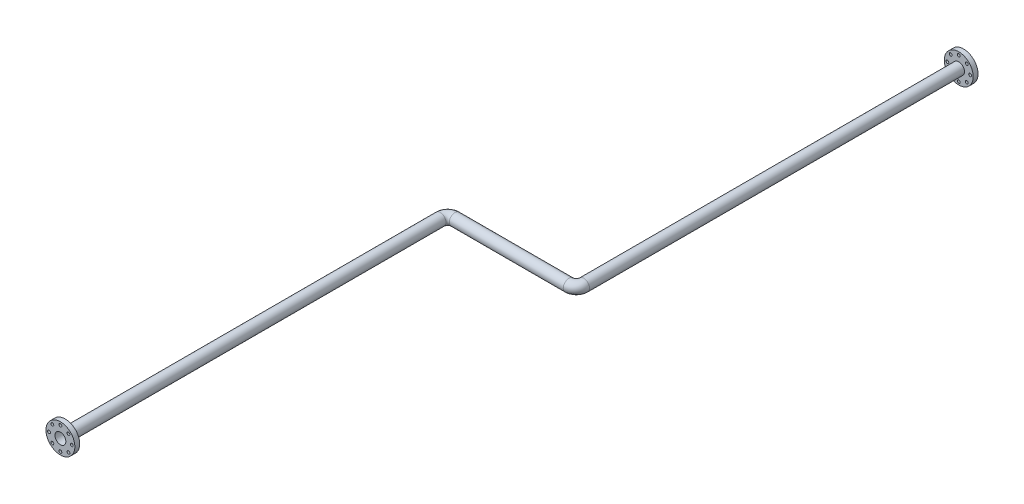
ISO-10303-21;
HEADER;
FILE_DESCRIPTION(('STEP AP214'),'2;1');
FILE_NAME('part.step','',(''),(''),'','','');
FILE_SCHEMA(('AUTOMOTIVE_DESIGN { 1 0 10303 214 1 1 1 1 }'));
ENDSEC;
DATA;
#1=APPLICATION_CONTEXT('core data for automotive mechanical design processes');
#2=APPLICATION_PROTOCOL_DEFINITION('international standard','automotive_design',2000,#1);
#3=PRODUCT_CONTEXT('',#1,'mechanical');
#4=PRODUCT('Part','Part','',(#3));
#5=PRODUCT_RELATED_PRODUCT_CATEGORY('part','',(#4));
#6=PRODUCT_DEFINITION_FORMATION('','',#4);
#7=PRODUCT_DEFINITION_CONTEXT('part definition',#1,'design');
#8=PRODUCT_DEFINITION('design','',#6,#7);
#9=PRODUCT_DEFINITION_SHAPE('','',#8);
#10=(LENGTH_UNIT() NAMED_UNIT(*) SI_UNIT(.MILLI.,.METRE.));
#11=(NAMED_UNIT(*) PLANE_ANGLE_UNIT() SI_UNIT($,.RADIAN.));
#12=(NAMED_UNIT(*) SI_UNIT($,.STERADIAN.) SOLID_ANGLE_UNIT());
#13=UNCERTAINTY_MEASURE_WITH_UNIT(LENGTH_MEASURE(1.E-05),#10,'distance_accuracy_value','');
#14=(GEOMETRIC_REPRESENTATION_CONTEXT(3) GLOBAL_UNCERTAINTY_ASSIGNED_CONTEXT((#13)) GLOBAL_UNIT_ASSIGNED_CONTEXT((#10,
#11,#12)) REPRESENTATION_CONTEXT('',''));
#15=CARTESIAN_POINT('',(0.,0.,0.));
#16=DIRECTION('',(0.,0.,1.));
#17=DIRECTION('',(1.,0.,0.));
#18=AXIS2_PLACEMENT_3D('',#15,#16,#17);
#19=CARTESIAN_POINT('',(338.999999999993,0.,-2039.));
#20=DIRECTION('',(0.,0.,1.));
#21=DIRECTION('',(1.,0.,0.));
#22=AXIS2_PLACEMENT_3D('',#19,#20,#21);
#23=CYLINDRICAL_SURFACE('',#22,30.25);
#24=CARTESIAN_POINT('',(339.,0.,-39.0000000000001));
#25=DIRECTION('',(0.,0.,-1.));
#26=DIRECTION('',(-1.,0.,0.));
#27=AXIS2_PLACEMENT_3D('',#24,#25,#26);
#28=CIRCLE('',#27,30.25);
#29=CARTESIAN_POINT('',(369.25,0.,-39.0000000000003));
#30=VERTEX_POINT('',#29);
#31=EDGE_CURVE('E125',#30,#30,#28,.T.);
#32=ORIENTED_EDGE('',*,*,#31,.T.);
#33=EDGE_LOOP('',(#32));
#34=FACE_BOUND('',#33,.T.);
#35=CARTESIAN_POINT('',(338.999999999993,0.,-2013.5));
#36=DIRECTION('',(0.,0.,-1.));
#37=DIRECTION('',(-1.,0.,0.));
#38=AXIS2_PLACEMENT_3D('',#35,#36,#37);
#39=CIRCLE('',#38,30.25);
#40=CARTESIAN_POINT('',(308.749999999993,0.,-2013.5));
#41=VERTEX_POINT('',#40);
#42=EDGE_CURVE('E10',#41,#41,#39,.T.);
#43=ORIENTED_EDGE('',*,*,#42,.F.);
#44=EDGE_LOOP('',(#43));
#45=FACE_BOUND('',#44,.T.);
#46=ADVANCED_FACE('F31',(#34,#45),#23,.T.);
#47=CARTESIAN_POINT('',(-339.,0.,2039.));
#48=DIRECTION('',(0.,0.,-1.));
#49=DIRECTION('',(-1.,0.,0.));
#50=AXIS2_PLACEMENT_3D('',#47,#48,#49);
#51=CYLINDRICAL_SURFACE('',#50,30.25);
#52=CARTESIAN_POINT('',(-339.,0.,39.0000000000001));
#53=DIRECTION('',(0.,0.,1.));
#54=DIRECTION('',(1.,0.,0.));
#55=AXIS2_PLACEMENT_3D('',#52,#53,#54);
#56=CIRCLE('',#55,30.25);
#57=CARTESIAN_POINT('',(-369.25,0.,39.0000000000003));
#58=VERTEX_POINT('',#57);
#59=EDGE_CURVE('E119',#58,#58,#56,.T.);
#60=ORIENTED_EDGE('',*,*,#59,.T.);
#61=EDGE_LOOP('',(#60));
#62=FACE_BOUND('',#61,.T.);
#63=CARTESIAN_POINT('',(-339.,0.,2013.5));
#64=DIRECTION('',(0.,0.,1.));
#65=DIRECTION('',(1.,0.,0.));
#66=AXIS2_PLACEMENT_3D('',#63,#64,#65);
#67=CIRCLE('',#66,30.25);
#68=CARTESIAN_POINT('',(-308.75,0.,2013.5));
#69=VERTEX_POINT('',#68);
#70=EDGE_CURVE('E39',#69,#69,#67,.T.);
#71=ORIENTED_EDGE('',*,*,#70,.F.);
#72=EDGE_LOOP('',(#71));
#73=FACE_BOUND('',#72,.T.);
#74=ADVANCED_FACE('F139',(#62,#73),#51,.T.);
#75=CARTESIAN_POINT('',(300.,0.,0.));
#76=DIRECTION('',(-1.,0.,0.));
#77=DIRECTION('',(0.,0.,1.));
#78=AXIS2_PLACEMENT_3D('',#75,#76,#77);
#79=CYLINDRICAL_SURFACE('',#78,30.25);
#80=CARTESIAN_POINT('',(300.,0.,0.));
#81=DIRECTION('',(1.,0.,0.));
#82=DIRECTION('',(0.,0.,-1.));
#83=AXIS2_PLACEMENT_3D('',#80,#81,#82);
#84=CIRCLE('',#83,30.25);
#85=CARTESIAN_POINT('',(300.,0.,30.25));
#86=VERTEX_POINT('',#85);
#87=EDGE_CURVE('E35',#86,#86,#84,.T.);
#88=ORIENTED_EDGE('',*,*,#87,.F.);
#89=EDGE_LOOP('',(#88));
#90=FACE_BOUND('',#89,.T.);
#91=CARTESIAN_POINT('',(-300.,0.,0.));
#92=DIRECTION('',(-1.,0.,0.));
#93=DIRECTION('',(0.,0.,1.));
#94=AXIS2_PLACEMENT_3D('',#91,#92,#93);
#95=CIRCLE('',#94,30.25);
#96=CARTESIAN_POINT('',(-300.,0.,-30.25));
#97=VERTEX_POINT('',#96);
#98=EDGE_CURVE('E114',#97,#97,#95,.T.);
#99=ORIENTED_EDGE('',*,*,#98,.F.);
#100=EDGE_LOOP('',(#99));
#101=FACE_BOUND('',#100,.T.);
#102=ADVANCED_FACE('F33',(#90,#101),#79,.T.);
#103=CARTESIAN_POINT('',(300.,0.,0.));
#104=DIRECTION('',(-1.,0.,0.));
#105=DIRECTION('',(0.,0.,1.));
#106=AXIS2_PLACEMENT_3D('',#103,#104,#105);
#107=CYLINDRICAL_SURFACE('',#106,28.65);
#108=CARTESIAN_POINT('',(300.,0.,0.));
#109=DIRECTION('',(1.,0.,0.));
#110=DIRECTION('',(0.,0.,-1.));
#111=AXIS2_PLACEMENT_3D('',#108,#109,#110);
#112=CIRCLE('',#111,28.65);
#113=CARTESIAN_POINT('',(300.,0.,28.65));
#114=VERTEX_POINT('',#113);
#115=EDGE_CURVE('E122',#114,#114,#112,.T.);
#116=ORIENTED_EDGE('',*,*,#115,.T.);
#117=EDGE_LOOP('',(#116));
#118=FACE_BOUND('',#117,.T.);
#119=CARTESIAN_POINT('',(-300.,0.,0.));
#120=DIRECTION('',(1.,0.,0.));
#121=DIRECTION('',(0.,0.,-1.));
#122=AXIS2_PLACEMENT_3D('',#119,#120,#121);
#123=CIRCLE('',#122,28.65);
#124=CARTESIAN_POINT('',(-300.,0.,-28.65));
#125=VERTEX_POINT('',#124);
#126=EDGE_CURVE('E127',#125,#125,#123,.T.);
#127=ORIENTED_EDGE('',*,*,#126,.F.);
#128=EDGE_LOOP('',(#127));
#129=FACE_BOUND('',#128,.T.);
#130=ADVANCED_FACE('F138',(#118,#129),#107,.F.);
#131=CARTESIAN_POINT('',(300.,0.,-39.));
#132=DIRECTION('',(0.,-1.,0.));
#133=DIRECTION('',(0.,0.,-1.));
#134=AXIS2_PLACEMENT_3D('',#131,#132,#133);
#135=TOROIDAL_SURFACE('',#134,39.,28.65);
#136=CARTESIAN_POINT('',(339.,0.,-39.0000000000001));
#137=DIRECTION('',(0.,0.,-1.));
#138=DIRECTION('',(-1.,0.,0.));
#139=AXIS2_PLACEMENT_3D('',#136,#137,#138);
#140=CIRCLE('',#139,28.65);
#141=CARTESIAN_POINT('',(367.65,0.,-39.0000000000002));
#142=VERTEX_POINT('',#141);
#143=EDGE_CURVE('E108',#142,#142,#140,.T.);
#144=CARTESIAN_POINT('',(300.,0.,-39.));
#145=DIRECTION('',(0.,-1.,0.));
#146=DIRECTION('',(0.,0.,-1.));
#147=AXIS2_PLACEMENT_3D('',#144,#145,#146);
#148=CIRCLE('',#147,67.65);
#149=EDGE_CURVE('',#142,#114,#148,.T.);
#150=ORIENTED_EDGE('',*,*,#143,.T.);
#151=ORIENTED_EDGE('',*,*,#115,.F.);
#152=ORIENTED_EDGE('',*,*,#149,.T.);
#153=ORIENTED_EDGE('',*,*,#149,.F.);
#154=EDGE_LOOP('',(#150,#152,#151,#153));
#155=FACE_BOUND('',#154,.T.);
#156=ADVANCED_FACE('F504',(#155),#135,.F.);
#157=CARTESIAN_POINT('',(300.,0.,-39.));
#158=DIRECTION('',(0.,-1.,0.));
#159=DIRECTION('',(0.,0.,-1.));
#160=AXIS2_PLACEMENT_3D('',#157,#158,#159);
#161=TOROIDAL_SURFACE('',#160,39.,30.25);
#162=CARTESIAN_POINT('',(300.,0.,-39.));
#163=DIRECTION('',(0.,-1.,0.));
#164=DIRECTION('',(0.,0.,-1.));
#165=AXIS2_PLACEMENT_3D('',#162,#163,#164);
#166=CIRCLE('',#165,69.25);
#167=EDGE_CURVE('',#30,#86,#166,.T.);
#168=ORIENTED_EDGE('',*,*,#31,.F.);
#169=ORIENTED_EDGE('',*,*,#87,.T.);
#170=ORIENTED_EDGE('',*,*,#167,.T.);
#171=ORIENTED_EDGE('',*,*,#167,.F.);
#172=EDGE_LOOP('',(#168,#170,#169,#171));
#173=FACE_BOUND('',#172,.T.);
#174=ADVANCED_FACE('F134',(#173),#161,.T.);
#175=CARTESIAN_POINT('',(-300.,0.,39.));
#176=DIRECTION('',(0.,-1.,0.));
#177=DIRECTION('',(0.,0.,-1.));
#178=AXIS2_PLACEMENT_3D('',#175,#176,#177);
#179=TOROIDAL_SURFACE('',#178,39.,28.65);
#180=CARTESIAN_POINT('',(-339.,0.,38.999999999999));
#181=DIRECTION('',(0.,0.,1.));
#182=DIRECTION('',(1.,0.,0.));
#183=AXIS2_PLACEMENT_3D('',#180,#181,#182);
#184=CIRCLE('',#183,28.65);
#185=CARTESIAN_POINT('',(-367.65,0.,38.9999999999982));
#186=VERTEX_POINT('',#185);
#187=EDGE_CURVE('E102',#186,#186,#184,.T.);
#188=CARTESIAN_POINT('',(-300.,0.,39.));
#189=DIRECTION('',(0.,-1.,0.));
#190=DIRECTION('',(0.,0.,-1.));
#191=AXIS2_PLACEMENT_3D('',#188,#189,#190);
#192=CIRCLE('',#191,67.65);
#193=EDGE_CURVE('',#186,#125,#192,.T.);
#194=ORIENTED_EDGE('',*,*,#187,.T.);
#195=ORIENTED_EDGE('',*,*,#126,.T.);
#196=ORIENTED_EDGE('',*,*,#193,.T.);
#197=ORIENTED_EDGE('',*,*,#193,.F.);
#198=EDGE_LOOP('',(#194,#196,#195,#197));
#199=FACE_BOUND('',#198,.T.);
#200=ADVANCED_FACE('F145',(#199),#179,.F.);
#201=CARTESIAN_POINT('',(-300.,0.,39.));
#202=DIRECTION('',(0.,-1.,0.));
#203=DIRECTION('',(0.,0.,-1.));
#204=AXIS2_PLACEMENT_3D('',#201,#202,#203);
#205=TOROIDAL_SURFACE('',#204,39.,30.25);
#206=CARTESIAN_POINT('',(-300.,0.,39.));
#207=DIRECTION('',(0.,-1.,0.));
#208=DIRECTION('',(0.,0.,-1.));
#209=AXIS2_PLACEMENT_3D('',#206,#207,#208);
#210=CIRCLE('',#209,69.25);
#211=EDGE_CURVE('',#58,#97,#210,.T.);
#212=ORIENTED_EDGE('',*,*,#59,.F.);
#213=ORIENTED_EDGE('',*,*,#98,.T.);
#214=ORIENTED_EDGE('',*,*,#211,.T.);
#215=ORIENTED_EDGE('',*,*,#211,.F.);
#216=EDGE_LOOP('',(#212,#214,#213,#215));
#217=FACE_BOUND('',#216,.T.);
#218=ADVANCED_FACE('F142',(#217),#205,.T.);
#219=CARTESIAN_POINT('',(338.999999999993,0.,-2039.));
#220=DIRECTION('',(0.,0.,-1.));
#221=DIRECTION('',(-1.,0.,0.));
#222=AXIS2_PLACEMENT_3D('',#219,#220,#221);
#223=PLANE('',#222);
#224=CARTESIAN_POINT('',(338.999999999993,0.,-2039.));
#225=DIRECTION('',(0.,0.,-1.));
#226=DIRECTION('',(-1.,0.,0.));
#227=AXIS2_PLACEMENT_3D('',#224,#225,#226);
#228=CIRCLE('',#227,28.65);
#229=CARTESIAN_POINT('',(310.349999999993,0.,-2039.));
#230=VERTEX_POINT('',#229);
#231=EDGE_CURVE('E111',#230,#230,#228,.T.);
#232=ORIENTED_EDGE('',*,*,#231,.F.);
#233=EDGE_LOOP('',(#232));
#234=FACE_BOUND('',#233,.T.);
#235=CARTESIAN_POINT('',(338.999999999993,0.,-2039.));
#236=DIRECTION('',(0.,0.,-1.));
#237=DIRECTION('',(-1.,0.,0.));
#238=AXIS2_PLACEMENT_3D('',#235,#236,#237);
#239=CIRCLE('',#238,76.);
#240=CARTESIAN_POINT('',(262.999999999993,0.,-2039.));
#241=VERTEX_POINT('',#240);
#242=EDGE_CURVE('E47',#241,#241,#239,.T.);
#243=ORIENTED_EDGE('',*,*,#242,.T.);
#244=EDGE_LOOP('',(#243));
#245=FACE_BOUND('',#244,.T.);
#246=CARTESIAN_POINT('',(338.999999999993,60.,-2039.));
#247=DIRECTION('',(0.,0.,-1.));
#248=DIRECTION('',(-1.,0.,0.));
#249=AXIS2_PLACEMENT_3D('',#246,#247,#248);
#250=CIRCLE('',#249,7.50000000000001);
#251=CARTESIAN_POINT('',(331.499999999993,60.,-2039.));
#252=VERTEX_POINT('',#251);
#253=EDGE_CURVE('E306',#252,#252,#250,.T.);
#254=ORIENTED_EDGE('',*,*,#253,.F.);
#255=EDGE_LOOP('',(#254));
#256=FACE_BOUND('',#255,.T.);
#257=CARTESIAN_POINT('',(296.5735931288,42.4264068711928,-2039.));
#258=DIRECTION('',(0.,0.,-1.));
#259=DIRECTION('',(-1.,0.,0.));
#260=AXIS2_PLACEMENT_3D('',#257,#258,#259);
#261=CIRCLE('',#260,7.50000000000377);
#262=CARTESIAN_POINT('',(289.073593128796,42.4264068711928,-2039.));
#263=VERTEX_POINT('',#262);
#264=EDGE_CURVE('E300',#263,#263,#261,.T.);
#265=ORIENTED_EDGE('',*,*,#264,.F.);
#266=EDGE_LOOP('',(#265));
#267=FACE_BOUND('',#266,.T.);
#268=CARTESIAN_POINT('',(278.999999999993,0.,-2039.));
#269=DIRECTION('',(0.,0.,-1.));
#270=DIRECTION('',(-1.,0.,0.));
#271=AXIS2_PLACEMENT_3D('',#268,#269,#270);
#272=CIRCLE('',#271,7.50000000000987);
#273=CARTESIAN_POINT('',(271.499999999983,0.,-2039.));
#274=VERTEX_POINT('',#273);
#275=EDGE_CURVE('E294',#274,#274,#272,.T.);
#276=ORIENTED_EDGE('',*,*,#275,.F.);
#277=EDGE_LOOP('',(#276));
#278=FACE_BOUND('',#277,.T.);
#279=CARTESIAN_POINT('',(296.5735931288,-42.4264068711928,-2039.));
#280=DIRECTION('',(0.,0.,-1.));
#281=DIRECTION('',(-1.,0.,0.));
#282=AXIS2_PLACEMENT_3D('',#279,#280,#281);
#283=CIRCLE('',#282,7.50000000001466);
#284=CARTESIAN_POINT('',(289.073593128785,-42.4264068711928,-2039.));
#285=VERTEX_POINT('',#284);
#286=EDGE_CURVE('E288',#285,#285,#283,.T.);
#287=ORIENTED_EDGE('',*,*,#286,.F.);
#288=EDGE_LOOP('',(#287));
#289=FACE_BOUND('',#288,.T.);
#290=CARTESIAN_POINT('',(338.999999999993,-60.,-2039.));
#291=DIRECTION('',(0.,0.,-1.));
#292=DIRECTION('',(-1.,0.,0.));
#293=AXIS2_PLACEMENT_3D('',#290,#291,#292);
#294=CIRCLE('',#293,7.50000000001519);
#295=CARTESIAN_POINT('',(331.499999999978,-60.,-2039.));
#296=VERTEX_POINT('',#295);
#297=EDGE_CURVE('E282',#296,#296,#294,.T.);
#298=ORIENTED_EDGE('',*,*,#297,.F.);
#299=EDGE_LOOP('',(#298));
#300=FACE_BOUND('',#299,.T.);
#301=CARTESIAN_POINT('',(381.426406871186,-42.4264068711928,-2039.));
#302=DIRECTION('',(0.,0.,-1.));
#303=DIRECTION('',(-1.,0.,0.));
#304=AXIS2_PLACEMENT_3D('',#301,#302,#303);
#305=CIRCLE('',#304,7.50000000001121);
#306=CARTESIAN_POINT('',(373.926406871175,-42.4264068711928,-2039.));
#307=VERTEX_POINT('',#306);
#308=EDGE_CURVE('E276',#307,#307,#305,.T.);
#309=ORIENTED_EDGE('',*,*,#308,.F.);
#310=EDGE_LOOP('',(#309));
#311=FACE_BOUND('',#310,.T.);
#312=CARTESIAN_POINT('',(398.999999999993,0.,-2039.));
#313=DIRECTION('',(0.,0.,-1.));
#314=DIRECTION('',(-1.,0.,0.));
#315=AXIS2_PLACEMENT_3D('',#312,#313,#314);
#316=CIRCLE('',#315,7.50000000000534);
#317=CARTESIAN_POINT('',(391.499999999988,0.,-2039.));
#318=VERTEX_POINT('',#317);
#319=EDGE_CURVE('E270',#318,#318,#316,.T.);
#320=ORIENTED_EDGE('',*,*,#319,.F.);
#321=EDGE_LOOP('',(#320));
#322=FACE_BOUND('',#321,.T.);
#323=CARTESIAN_POINT('',(381.426406871186,42.4264068711928,-2039.));
#324=DIRECTION('',(0.,0.,-1.));
#325=DIRECTION('',(-1.,0.,0.));
#326=AXIS2_PLACEMENT_3D('',#323,#324,#325);
#327=CIRCLE('',#326,7.5000000000006);
#328=CARTESIAN_POINT('',(373.926406871185,42.4264068711928,-2039.));
#329=VERTEX_POINT('',#328);
#330=EDGE_CURVE('E267',#329,#329,#327,.T.);
#331=ORIENTED_EDGE('',*,*,#330,.F.);
#332=EDGE_LOOP('',(#331));
#333=FACE_BOUND('',#332,.T.);
#334=ADVANCED_FACE('F144',(#234,#245,#256,#267,#278,#289,#300,#311,#322,#333),#223,.T.);
#335=CARTESIAN_POINT('',(338.999999999993,0.,-2039.));
#336=DIRECTION('',(0.,0.,1.));
#337=DIRECTION('',(1.,0.,0.));
#338=AXIS2_PLACEMENT_3D('',#335,#336,#337);
#339=CYLINDRICAL_SURFACE('',#338,28.65);
#340=ORIENTED_EDGE('',*,*,#231,.T.);
#341=EDGE_LOOP('',(#340));
#342=FACE_BOUND('',#341,.T.);
#343=ORIENTED_EDGE('',*,*,#143,.F.);
#344=EDGE_LOOP('',(#343));
#345=FACE_BOUND('',#344,.T.);
#346=ADVANCED_FACE('F152',(#342,#345),#339,.F.);
#347=CARTESIAN_POINT('',(-339.,0.,2039.));
#348=DIRECTION('',(0.,0.,1.));
#349=DIRECTION('',(1.,0.,0.));
#350=AXIS2_PLACEMENT_3D('',#347,#348,#349);
#351=PLANE('',#350);
#352=CARTESIAN_POINT('',(-339.,0.,2039.));
#353=DIRECTION('',(0.,0.,1.));
#354=DIRECTION('',(1.,0.,0.));
#355=AXIS2_PLACEMENT_3D('',#352,#353,#354);
#356=CIRCLE('',#355,28.65);
#357=CARTESIAN_POINT('',(-310.35,0.,2039.));
#358=VERTEX_POINT('',#357);
#359=EDGE_CURVE('E105',#358,#358,#356,.T.);
#360=ORIENTED_EDGE('',*,*,#359,.F.);
#361=EDGE_LOOP('',(#360));
#362=FACE_BOUND('',#361,.T.);
#363=CARTESIAN_POINT('',(-339.,0.,2039.));
#364=DIRECTION('',(0.,0.,1.));
#365=DIRECTION('',(1.,0.,0.));
#366=AXIS2_PLACEMENT_3D('',#363,#364,#365);
#367=CIRCLE('',#366,76.);
#368=CARTESIAN_POINT('',(-263.,0.,2039.));
#369=VERTEX_POINT('',#368);
#370=EDGE_CURVE('E96',#369,#369,#367,.T.);
#371=ORIENTED_EDGE('',*,*,#370,.T.);
#372=EDGE_LOOP('',(#371));
#373=FACE_BOUND('',#372,.T.);
#374=CARTESIAN_POINT('',(-296.573593128806,42.4264068711961,2039.));
#375=DIRECTION('',(0.,0.,1.));
#376=DIRECTION('',(1.,0.,0.));
#377=AXIS2_PLACEMENT_3D('',#374,#375,#376);
#378=CIRCLE('',#377,7.50000000000001);
#379=CARTESIAN_POINT('',(-289.073593128806,42.4264068711961,2039.));
#380=VERTEX_POINT('',#379);
#381=EDGE_CURVE('E90',#380,#380,#378,.T.);
#382=ORIENTED_EDGE('',*,*,#381,.F.);
#383=EDGE_LOOP('',(#382));
#384=FACE_BOUND('',#383,.T.);
#385=CARTESIAN_POINT('',(-339.,60.,2039.));
#386=DIRECTION('',(0.,0.,1.));
#387=DIRECTION('',(1.,0.,0.));
#388=AXIS2_PLACEMENT_3D('',#385,#386,#387);
#389=CIRCLE('',#388,7.50000000000001);
#390=CARTESIAN_POINT('',(-331.5,60.,2039.));
#391=VERTEX_POINT('',#390);
#392=EDGE_CURVE('E84',#391,#391,#389,.T.);
#393=ORIENTED_EDGE('',*,*,#392,.F.);
#394=EDGE_LOOP('',(#393));
#395=FACE_BOUND('',#394,.T.);
#396=CARTESIAN_POINT('',(-279.,0.,2039.));
#397=DIRECTION('',(0.,0.,1.));
#398=DIRECTION('',(1.,0.,0.));
#399=AXIS2_PLACEMENT_3D('',#396,#397,#398);
#400=CIRCLE('',#399,7.5000000000057);
#401=CARTESIAN_POINT('',(-271.499999999994,0.,2039.));
#402=VERTEX_POINT('',#401);
#403=EDGE_CURVE('E78',#402,#402,#400,.T.);
#404=ORIENTED_EDGE('',*,*,#403,.F.);
#405=EDGE_LOOP('',(#404));
#406=FACE_BOUND('',#405,.T.);
#407=CARTESIAN_POINT('',(-296.573593128807,-42.4264068711928,2039.));
#408=DIRECTION('',(0.,0.,1.));
#409=DIRECTION('',(1.,0.,0.));
#410=AXIS2_PLACEMENT_3D('',#407,#408,#409);
#411=CIRCLE('',#410,7.50000000000839);
#412=CARTESIAN_POINT('',(-289.073593128799,-42.4264068711928,2039.));
#413=VERTEX_POINT('',#412);
#414=EDGE_CURVE('E72',#413,#413,#411,.T.);
#415=ORIENTED_EDGE('',*,*,#414,.F.);
#416=EDGE_LOOP('',(#415));
#417=FACE_BOUND('',#416,.T.);
#418=CARTESIAN_POINT('',(-339.,-60.,2039.));
#419=DIRECTION('',(0.,0.,1.));
#420=DIRECTION('',(1.,0.,0.));
#421=AXIS2_PLACEMENT_3D('',#418,#419,#420);
#422=CIRCLE('',#421,7.50000000000877);
#423=CARTESIAN_POINT('',(-331.499999999991,-60.,2039.));
#424=VERTEX_POINT('',#423);
#425=EDGE_CURVE('E66',#424,#424,#422,.T.);
#426=ORIENTED_EDGE('',*,*,#425,.F.);
#427=EDGE_LOOP('',(#426));
#428=FACE_BOUND('',#427,.T.);
#429=CARTESIAN_POINT('',(-381.426406871193,-42.4264068711929,2039.));
#430=DIRECTION('',(0.,0.,1.));
#431=DIRECTION('',(1.,0.,0.));
#432=AXIS2_PLACEMENT_3D('',#429,#430,#431);
#433=CIRCLE('',#432,7.50000000000655);
#434=CARTESIAN_POINT('',(-373.926406871186,-42.4264068711929,2039.));
#435=VERTEX_POINT('',#434);
#436=EDGE_CURVE('E60',#435,#435,#433,.T.);
#437=ORIENTED_EDGE('',*,*,#436,.F.);
#438=EDGE_LOOP('',(#437));
#439=FACE_BOUND('',#438,.T.);
#440=CARTESIAN_POINT('',(-399.,0.,2039.));
#441=DIRECTION('',(0.,0.,1.));
#442=DIRECTION('',(1.,0.,0.));
#443=AXIS2_PLACEMENT_3D('',#440,#441,#442);
#444=CIRCLE('',#443,7.50000000000309);
#445=CARTESIAN_POINT('',(-391.499999999997,0.,2039.));
#446=VERTEX_POINT('',#445);
#447=EDGE_CURVE('E52',#446,#446,#444,.T.);
#448=ORIENTED_EDGE('',*,*,#447,.F.);
#449=EDGE_LOOP('',(#448));
#450=FACE_BOUND('',#449,.T.);
#451=CARTESIAN_POINT('',(-381.426406871191,42.4264068711896,2039.));
#452=DIRECTION('',(0.,0.,1.));
#453=DIRECTION('',(1.,0.,0.));
#454=AXIS2_PLACEMENT_3D('',#451,#452,#453);
#455=CIRCLE('',#454,7.50000000000007);
#456=CARTESIAN_POINT('',(-373.926406871191,42.4264068711896,2039.));
#457=VERTEX_POINT('',#456);
#458=EDGE_CURVE('E53',#457,#457,#455,.T.);
#459=ORIENTED_EDGE('',*,*,#458,.F.);
#460=EDGE_LOOP('',(#459));
#461=FACE_BOUND('',#460,.T.);
#462=ADVANCED_FACE('F170',(#362,#373,#384,#395,#406,#417,#428,#439,#450,#461),#351,.T.);
#463=CARTESIAN_POINT('',(-339.,0.,2039.));
#464=DIRECTION('',(0.,0.,-1.));
#465=DIRECTION('',(-1.,0.,0.));
#466=AXIS2_PLACEMENT_3D('',#463,#464,#465);
#467=CYLINDRICAL_SURFACE('',#466,28.65);
#468=ORIENTED_EDGE('',*,*,#359,.T.);
#469=EDGE_LOOP('',(#468));
#470=FACE_BOUND('',#469,.T.);
#471=ORIENTED_EDGE('',*,*,#187,.F.);
#472=EDGE_LOOP('',(#471));
#473=FACE_BOUND('',#472,.T.);
#474=ADVANCED_FACE('F175',(#470,#473),#467,.F.);
#475=CARTESIAN_POINT('',(-339.,0.,2013.5));
#476=DIRECTION('',(0.,0.,1.));
#477=DIRECTION('',(1.,0.,0.));
#478=AXIS2_PLACEMENT_3D('',#475,#476,#477);
#479=PLANE('',#478);
#480=CARTESIAN_POINT('',(-339.,0.,2013.5));
#481=DIRECTION('',(0.,0.,1.));
#482=DIRECTION('',(1.,0.,0.));
#483=AXIS2_PLACEMENT_3D('',#480,#481,#482);
#484=CIRCLE('',#483,76.);
#485=CARTESIAN_POINT('',(-263.,0.,2013.5));
#486=VERTEX_POINT('',#485);
#487=EDGE_CURVE('E99',#486,#486,#484,.T.);
#488=ORIENTED_EDGE('',*,*,#487,.F.);
#489=EDGE_LOOP('',(#488));
#490=FACE_BOUND('',#489,.T.);
#491=CARTESIAN_POINT('',(-296.573593128806,42.4264068711961,2013.5));
#492=DIRECTION('',(0.,0.,1.));
#493=DIRECTION('',(1.,0.,0.));
#494=AXIS2_PLACEMENT_3D('',#491,#492,#493);
#495=CIRCLE('',#494,7.50000000000001);
#496=CARTESIAN_POINT('',(-289.073593128806,42.4264068711961,2013.5));
#497=VERTEX_POINT('',#496);
#498=EDGE_CURVE('E93',#497,#497,#495,.T.);
#499=ORIENTED_EDGE('',*,*,#498,.T.);
#500=EDGE_LOOP('',(#499));
#501=FACE_BOUND('',#500,.T.);
#502=CARTESIAN_POINT('',(-339.,60.,2013.5));
#503=DIRECTION('',(0.,0.,1.));
#504=DIRECTION('',(1.,0.,0.));
#505=AXIS2_PLACEMENT_3D('',#502,#503,#504);
#506=CIRCLE('',#505,7.50000000000001);
#507=CARTESIAN_POINT('',(-331.5,60.,2013.5));
#508=VERTEX_POINT('',#507);
#509=EDGE_CURVE('E87',#508,#508,#506,.T.);
#510=ORIENTED_EDGE('',*,*,#509,.T.);
#511=EDGE_LOOP('',(#510));
#512=FACE_BOUND('',#511,.T.);
#513=CARTESIAN_POINT('',(-279.,0.,2013.5));
#514=DIRECTION('',(0.,0.,1.));
#515=DIRECTION('',(1.,0.,0.));
#516=AXIS2_PLACEMENT_3D('',#513,#514,#515);
#517=CIRCLE('',#516,7.5000000000057);
#518=CARTESIAN_POINT('',(-271.499999999994,0.,2013.5));
#519=VERTEX_POINT('',#518);
#520=EDGE_CURVE('E81',#519,#519,#517,.T.);
#521=ORIENTED_EDGE('',*,*,#520,.T.);
#522=EDGE_LOOP('',(#521));
#523=FACE_BOUND('',#522,.T.);
#524=CARTESIAN_POINT('',(-296.573593128807,-42.4264068711928,2013.5));
#525=DIRECTION('',(0.,0.,1.));
#526=DIRECTION('',(1.,0.,0.));
#527=AXIS2_PLACEMENT_3D('',#524,#525,#526);
#528=CIRCLE('',#527,7.50000000000839);
#529=CARTESIAN_POINT('',(-289.073593128799,-42.4264068711928,2013.5));
#530=VERTEX_POINT('',#529);
#531=EDGE_CURVE('E75',#530,#530,#528,.T.);
#532=ORIENTED_EDGE('',*,*,#531,.T.);
#533=EDGE_LOOP('',(#532));
#534=FACE_BOUND('',#533,.T.);
#535=CARTESIAN_POINT('',(-339.,-60.,2013.5));
#536=DIRECTION('',(0.,0.,1.));
#537=DIRECTION('',(1.,0.,0.));
#538=AXIS2_PLACEMENT_3D('',#535,#536,#537);
#539=CIRCLE('',#538,7.50000000000877);
#540=CARTESIAN_POINT('',(-331.499999999991,-60.,2013.5));
#541=VERTEX_POINT('',#540);
#542=EDGE_CURVE('E69',#541,#541,#539,.T.);
#543=ORIENTED_EDGE('',*,*,#542,.T.);
#544=EDGE_LOOP('',(#543));
#545=FACE_BOUND('',#544,.T.);
#546=CARTESIAN_POINT('',(-381.426406871193,-42.4264068711929,2013.5));
#547=DIRECTION('',(0.,0.,1.));
#548=DIRECTION('',(1.,0.,0.));
#549=AXIS2_PLACEMENT_3D('',#546,#547,#548);
#550=CIRCLE('',#549,7.50000000000655);
#551=CARTESIAN_POINT('',(-373.926406871186,-42.4264068711929,2013.5));
#552=VERTEX_POINT('',#551);
#553=EDGE_CURVE('E63',#552,#552,#550,.T.);
#554=ORIENTED_EDGE('',*,*,#553,.T.);
#555=EDGE_LOOP('',(#554));
#556=FACE_BOUND('',#555,.T.);
#557=CARTESIAN_POINT('',(-399.,0.,2013.5));
#558=DIRECTION('',(0.,0.,1.));
#559=DIRECTION('',(1.,0.,0.));
#560=AXIS2_PLACEMENT_3D('',#557,#558,#559);
#561=CIRCLE('',#560,7.50000000000309);
#562=CARTESIAN_POINT('',(-391.499999999997,0.,2013.5));
#563=VERTEX_POINT('',#562);
#564=EDGE_CURVE('E57',#563,#563,#561,.T.);
#565=ORIENTED_EDGE('',*,*,#564,.T.);
#566=EDGE_LOOP('',(#565));
#567=FACE_BOUND('',#566,.T.);
#568=CARTESIAN_POINT('',(-381.426406871191,42.4264068711896,2013.5));
#569=DIRECTION('',(0.,0.,1.));
#570=DIRECTION('',(1.,0.,0.));
#571=AXIS2_PLACEMENT_3D('',#568,#569,#570);
#572=CIRCLE('',#571,7.50000000000007);
#573=CARTESIAN_POINT('',(-373.926406871191,42.4264068711896,2013.5));
#574=VERTEX_POINT('',#573);
#575=EDGE_CURVE('E49',#574,#574,#572,.T.);
#576=ORIENTED_EDGE('',*,*,#575,.T.);
#577=EDGE_LOOP('',(#576));
#578=FACE_BOUND('',#577,.T.);
#579=ORIENTED_EDGE('',*,*,#70,.T.);
#580=EDGE_LOOP('',(#579));
#581=FACE_BOUND('',#580,.T.);
#582=ADVANCED_FACE('F179',(#490,#501,#512,#523,#534,#545,#556,#567,#578,#581),#479,.F.);
#583=CARTESIAN_POINT('',(-339.,0.,2013.5));
#584=DIRECTION('',(0.,0.,1.));
#585=DIRECTION('',(1.,0.,0.));
#586=AXIS2_PLACEMENT_3D('',#583,#584,#585);
#587=CYLINDRICAL_SURFACE('',#586,76.);
#588=ORIENTED_EDGE('',*,*,#487,.T.);
#589=EDGE_LOOP('',(#588));
#590=FACE_BOUND('',#589,.T.);
#591=ORIENTED_EDGE('',*,*,#370,.F.);
#592=EDGE_LOOP('',(#591));
#593=FACE_BOUND('',#592,.T.);
#594=ADVANCED_FACE('F181',(#590,#593),#587,.T.);
#595=CARTESIAN_POINT('',(-296.573593128806,42.4264068711961,2013.5));
#596=DIRECTION('',(0.,0.,1.));
#597=DIRECTION('',(1.,0.,0.));
#598=AXIS2_PLACEMENT_3D('',#595,#596,#597);
#599=CYLINDRICAL_SURFACE('',#598,7.50000000000001);
#600=ORIENTED_EDGE('',*,*,#498,.F.);
#601=EDGE_LOOP('',(#600));
#602=FACE_BOUND('',#601,.T.);
#603=ORIENTED_EDGE('',*,*,#381,.T.);
#604=EDGE_LOOP('',(#603));
#605=FACE_BOUND('',#604,.T.);
#606=ADVANCED_FACE('F184',(#602,#605),#599,.F.);
#607=CARTESIAN_POINT('',(-339.,60.,2013.5));
#608=DIRECTION('',(0.,0.,1.));
#609=DIRECTION('',(1.,0.,0.));
#610=AXIS2_PLACEMENT_3D('',#607,#608,#609);
#611=CYLINDRICAL_SURFACE('',#610,7.50000000000001);
#612=ORIENTED_EDGE('',*,*,#509,.F.);
#613=EDGE_LOOP('',(#612));
#614=FACE_BOUND('',#613,.T.);
#615=ORIENTED_EDGE('',*,*,#392,.T.);
#616=EDGE_LOOP('',(#615));
#617=FACE_BOUND('',#616,.T.);
#618=ADVANCED_FACE('F191',(#614,#617),#611,.F.);
#619=CARTESIAN_POINT('',(-279.,0.,2013.5));
#620=DIRECTION('',(0.,0.,1.));
#621=DIRECTION('',(1.,0.,0.));
#622=AXIS2_PLACEMENT_3D('',#619,#620,#621);
#623=CYLINDRICAL_SURFACE('',#622,7.5000000000057);
#624=ORIENTED_EDGE('',*,*,#520,.F.);
#625=EDGE_LOOP('',(#624));
#626=FACE_BOUND('',#625,.T.);
#627=ORIENTED_EDGE('',*,*,#403,.T.);
#628=EDGE_LOOP('',(#627));
#629=FACE_BOUND('',#628,.T.);
#630=ADVANCED_FACE('F195',(#626,#629),#623,.F.);
#631=CARTESIAN_POINT('',(-296.573593128807,-42.4264068711928,2013.5));
#632=DIRECTION('',(0.,0.,1.));
#633=DIRECTION('',(1.,0.,0.));
#634=AXIS2_PLACEMENT_3D('',#631,#632,#633);
#635=CYLINDRICAL_SURFACE('',#634,7.50000000000839);
#636=ORIENTED_EDGE('',*,*,#531,.F.);
#637=EDGE_LOOP('',(#636));
#638=FACE_BOUND('',#637,.T.);
#639=ORIENTED_EDGE('',*,*,#414,.T.);
#640=EDGE_LOOP('',(#639));
#641=FACE_BOUND('',#640,.T.);
#642=ADVANCED_FACE('F199',(#638,#641),#635,.F.);
#643=CARTESIAN_POINT('',(-339.,-60.,2013.5));
#644=DIRECTION('',(0.,0.,1.));
#645=DIRECTION('',(1.,0.,0.));
#646=AXIS2_PLACEMENT_3D('',#643,#644,#645);
#647=CYLINDRICAL_SURFACE('',#646,7.50000000000877);
#648=ORIENTED_EDGE('',*,*,#542,.F.);
#649=EDGE_LOOP('',(#648));
#650=FACE_BOUND('',#649,.T.);
#651=ORIENTED_EDGE('',*,*,#425,.T.);
#652=EDGE_LOOP('',(#651));
#653=FACE_BOUND('',#652,.T.);
#654=ADVANCED_FACE('F203',(#650,#653),#647,.F.);
#655=CARTESIAN_POINT('',(-381.426406871193,-42.4264068711929,2013.5));
#656=DIRECTION('',(0.,0.,1.));
#657=DIRECTION('',(1.,0.,0.));
#658=AXIS2_PLACEMENT_3D('',#655,#656,#657);
#659=CYLINDRICAL_SURFACE('',#658,7.50000000000655);
#660=ORIENTED_EDGE('',*,*,#553,.F.);
#661=EDGE_LOOP('',(#660));
#662=FACE_BOUND('',#661,.T.);
#663=ORIENTED_EDGE('',*,*,#436,.T.);
#664=EDGE_LOOP('',(#663));
#665=FACE_BOUND('',#664,.T.);
#666=ADVANCED_FACE('F207',(#662,#665),#659,.F.);
#667=CARTESIAN_POINT('',(-399.,0.,2013.5));
#668=DIRECTION('',(0.,0.,1.));
#669=DIRECTION('',(1.,0.,0.));
#670=AXIS2_PLACEMENT_3D('',#667,#668,#669);
#671=CYLINDRICAL_SURFACE('',#670,7.50000000000309);
#672=ORIENTED_EDGE('',*,*,#564,.F.);
#673=EDGE_LOOP('',(#672));
#674=FACE_BOUND('',#673,.T.);
#675=ORIENTED_EDGE('',*,*,#447,.T.);
#676=EDGE_LOOP('',(#675));
#677=FACE_BOUND('',#676,.T.);
#678=ADVANCED_FACE('F211',(#674,#677),#671,.F.);
#679=CARTESIAN_POINT('',(-381.426406871191,42.4264068711896,2013.5));
#680=DIRECTION('',(0.,0.,1.));
#681=DIRECTION('',(1.,0.,0.));
#682=AXIS2_PLACEMENT_3D('',#679,#680,#681);
#683=CYLINDRICAL_SURFACE('',#682,7.50000000000007);
#684=ORIENTED_EDGE('',*,*,#575,.F.);
#685=EDGE_LOOP('',(#684));
#686=FACE_BOUND('',#685,.T.);
#687=ORIENTED_EDGE('',*,*,#458,.T.);
#688=EDGE_LOOP('',(#687));
#689=FACE_BOUND('',#688,.T.);
#690=ADVANCED_FACE('F215',(#686,#689),#683,.F.);
#691=CARTESIAN_POINT('',(338.999999999993,0.,-2013.5));
#692=DIRECTION('',(0.,0.,-1.));
#693=DIRECTION('',(-1.,0.,0.));
#694=AXIS2_PLACEMENT_3D('',#691,#692,#693);
#695=PLANE('',#694);
#696=CARTESIAN_POINT('',(338.999999999993,0.,-2013.5));
#697=DIRECTION('',(0.,0.,-1.));
#698=DIRECTION('',(-1.,0.,0.));
#699=AXIS2_PLACEMENT_3D('',#696,#697,#698);
#700=CIRCLE('',#699,76.);
#701=CARTESIAN_POINT('',(262.999999999993,0.,-2013.5));
#702=VERTEX_POINT('',#701);
#703=EDGE_CURVE('E56',#702,#702,#700,.T.);
#704=ORIENTED_EDGE('',*,*,#703,.F.);
#705=EDGE_LOOP('',(#704));
#706=FACE_BOUND('',#705,.T.);
#707=CARTESIAN_POINT('',(338.999999999993,60.,-2013.5));
#708=DIRECTION('',(0.,0.,-1.));
#709=DIRECTION('',(-1.,0.,0.));
#710=AXIS2_PLACEMENT_3D('',#707,#708,#709);
#711=CIRCLE('',#710,7.50000000000001);
#712=CARTESIAN_POINT('',(331.499999999993,60.,-2013.5));
#713=VERTEX_POINT('',#712);
#714=EDGE_CURVE('E309',#713,#713,#711,.T.);
#715=ORIENTED_EDGE('',*,*,#714,.T.);
#716=EDGE_LOOP('',(#715));
#717=FACE_BOUND('',#716,.T.);
#718=CARTESIAN_POINT('',(296.5735931288,42.4264068711928,-2013.5));
#719=DIRECTION('',(0.,0.,-1.));
#720=DIRECTION('',(-1.,0.,0.));
#721=AXIS2_PLACEMENT_3D('',#718,#719,#720);
#722=CIRCLE('',#721,7.50000000000377);
#723=CARTESIAN_POINT('',(289.073593128796,42.4264068711928,-2013.5));
#724=VERTEX_POINT('',#723);
#725=EDGE_CURVE('E303',#724,#724,#722,.T.);
#726=ORIENTED_EDGE('',*,*,#725,.T.);
#727=EDGE_LOOP('',(#726));
#728=FACE_BOUND('',#727,.T.);
#729=CARTESIAN_POINT('',(278.999999999993,0.,-2013.5));
#730=DIRECTION('',(0.,0.,-1.));
#731=DIRECTION('',(-1.,0.,0.));
#732=AXIS2_PLACEMENT_3D('',#729,#730,#731);
#733=CIRCLE('',#732,7.50000000000987);
#734=CARTESIAN_POINT('',(271.499999999983,0.,-2013.5));
#735=VERTEX_POINT('',#734);
#736=EDGE_CURVE('E297',#735,#735,#733,.T.);
#737=ORIENTED_EDGE('',*,*,#736,.T.);
#738=EDGE_LOOP('',(#737));
#739=FACE_BOUND('',#738,.T.);
#740=CARTESIAN_POINT('',(296.5735931288,-42.4264068711928,-2013.5));
#741=DIRECTION('',(0.,0.,-1.));
#742=DIRECTION('',(-1.,0.,0.));
#743=AXIS2_PLACEMENT_3D('',#740,#741,#742);
#744=CIRCLE('',#743,7.50000000001466);
#745=CARTESIAN_POINT('',(289.073593128786,-42.4264068711928,-2013.5));
#746=VERTEX_POINT('',#745);
#747=EDGE_CURVE('E291',#746,#746,#744,.T.);
#748=ORIENTED_EDGE('',*,*,#747,.T.);
#749=EDGE_LOOP('',(#748));
#750=FACE_BOUND('',#749,.T.);
#751=CARTESIAN_POINT('',(338.999999999993,-60.,-2013.5));
#752=DIRECTION('',(0.,0.,-1.));
#753=DIRECTION('',(-1.,0.,0.));
#754=AXIS2_PLACEMENT_3D('',#751,#752,#753);
#755=CIRCLE('',#754,7.50000000001519);
#756=CARTESIAN_POINT('',(331.499999999978,-60.,-2013.5));
#757=VERTEX_POINT('',#756);
#758=EDGE_CURVE('E285',#757,#757,#755,.T.);
#759=ORIENTED_EDGE('',*,*,#758,.T.);
#760=EDGE_LOOP('',(#759));
#761=FACE_BOUND('',#760,.T.);
#762=CARTESIAN_POINT('',(381.426406871186,-42.4264068711928,-2013.5));
#763=DIRECTION('',(0.,0.,-1.));
#764=DIRECTION('',(-1.,0.,0.));
#765=AXIS2_PLACEMENT_3D('',#762,#763,#764);
#766=CIRCLE('',#765,7.50000000001121);
#767=CARTESIAN_POINT('',(373.926406871175,-42.4264068711928,-2013.5));
#768=VERTEX_POINT('',#767);
#769=EDGE_CURVE('E279',#768,#768,#766,.T.);
#770=ORIENTED_EDGE('',*,*,#769,.T.);
#771=EDGE_LOOP('',(#770));
#772=FACE_BOUND('',#771,.T.);
#773=CARTESIAN_POINT('',(398.999999999993,0.,-2013.5));
#774=DIRECTION('',(0.,0.,-1.));
#775=DIRECTION('',(-1.,0.,0.));
#776=AXIS2_PLACEMENT_3D('',#773,#774,#775);
#777=CIRCLE('',#776,7.50000000000534);
#778=CARTESIAN_POINT('',(391.499999999988,0.,-2013.5));
#779=VERTEX_POINT('',#778);
#780=EDGE_CURVE('E273',#779,#779,#777,.T.);
#781=ORIENTED_EDGE('',*,*,#780,.T.);
#782=EDGE_LOOP('',(#781));
#783=FACE_BOUND('',#782,.T.);
#784=CARTESIAN_POINT('',(381.426406871186,42.4264068711928,-2013.5));
#785=DIRECTION('',(0.,0.,-1.));
#786=DIRECTION('',(-1.,0.,0.));
#787=AXIS2_PLACEMENT_3D('',#784,#785,#786);
#788=CIRCLE('',#787,7.5000000000006);
#789=CARTESIAN_POINT('',(373.926406871185,42.4264068711928,-2013.5));
#790=VERTEX_POINT('',#789);
#791=EDGE_CURVE('E264',#790,#790,#788,.T.);
#792=ORIENTED_EDGE('',*,*,#791,.T.);
#793=EDGE_LOOP('',(#792));
#794=FACE_BOUND('',#793,.T.);
#795=ORIENTED_EDGE('',*,*,#42,.T.);
#796=EDGE_LOOP('',(#795));
#797=FACE_BOUND('',#796,.T.);
#798=ADVANCED_FACE('F219',(#706,#717,#728,#739,#750,#761,#772,#783,#794,#797),#695,.F.);
#799=CARTESIAN_POINT('',(338.999999999993,0.,-2013.5));
#800=DIRECTION('',(0.,0.,-1.));
#801=DIRECTION('',(-1.,0.,0.));
#802=AXIS2_PLACEMENT_3D('',#799,#800,#801);
#803=CYLINDRICAL_SURFACE('',#802,76.);
#804=ORIENTED_EDGE('',*,*,#703,.T.);
#805=EDGE_LOOP('',(#804));
#806=FACE_BOUND('',#805,.T.);
#807=ORIENTED_EDGE('',*,*,#242,.F.);
#808=EDGE_LOOP('',(#807));
#809=FACE_BOUND('',#808,.T.);
#810=ADVANCED_FACE('F221',(#806,#809),#803,.T.);
#811=CARTESIAN_POINT('',(338.999999999993,60.,-2013.5));
#812=DIRECTION('',(0.,0.,-1.));
#813=DIRECTION('',(-1.,0.,0.));
#814=AXIS2_PLACEMENT_3D('',#811,#812,#813);
#815=CYLINDRICAL_SURFACE('',#814,7.50000000000001);
#816=ORIENTED_EDGE('',*,*,#714,.F.);
#817=EDGE_LOOP('',(#816));
#818=FACE_BOUND('',#817,.T.);
#819=ORIENTED_EDGE('',*,*,#253,.T.);
#820=EDGE_LOOP('',(#819));
#821=FACE_BOUND('',#820,.T.);
#822=ADVANCED_FACE('F224',(#818,#821),#815,.F.);
#823=CARTESIAN_POINT('',(296.5735931288,42.4264068711928,-2013.5));
#824=DIRECTION('',(0.,0.,-1.));
#825=DIRECTION('',(-1.,0.,0.));
#826=AXIS2_PLACEMENT_3D('',#823,#824,#825);
#827=CYLINDRICAL_SURFACE('',#826,7.50000000000377);
#828=ORIENTED_EDGE('',*,*,#725,.F.);
#829=EDGE_LOOP('',(#828));
#830=FACE_BOUND('',#829,.T.);
#831=ORIENTED_EDGE('',*,*,#264,.T.);
#832=EDGE_LOOP('',(#831));
#833=FACE_BOUND('',#832,.T.);
#834=ADVANCED_FACE('F231',(#830,#833),#827,.F.);
#835=CARTESIAN_POINT('',(278.999999999993,0.,-2013.5));
#836=DIRECTION('',(0.,0.,-1.));
#837=DIRECTION('',(-1.,0.,0.));
#838=AXIS2_PLACEMENT_3D('',#835,#836,#837);
#839=CYLINDRICAL_SURFACE('',#838,7.50000000000987);
#840=ORIENTED_EDGE('',*,*,#736,.F.);
#841=EDGE_LOOP('',(#840));
#842=FACE_BOUND('',#841,.T.);
#843=ORIENTED_EDGE('',*,*,#275,.T.);
#844=EDGE_LOOP('',(#843));
#845=FACE_BOUND('',#844,.T.);
#846=ADVANCED_FACE('F235',(#842,#845),#839,.F.);
#847=CARTESIAN_POINT('',(296.5735931288,-42.4264068711928,-2013.5));
#848=DIRECTION('',(0.,0.,-1.));
#849=DIRECTION('',(-1.,0.,0.));
#850=AXIS2_PLACEMENT_3D('',#847,#848,#849);
#851=CYLINDRICAL_SURFACE('',#850,7.50000000001466);
#852=ORIENTED_EDGE('',*,*,#747,.F.);
#853=EDGE_LOOP('',(#852));
#854=FACE_BOUND('',#853,.T.);
#855=ORIENTED_EDGE('',*,*,#286,.T.);
#856=EDGE_LOOP('',(#855));
#857=FACE_BOUND('',#856,.T.);
#858=ADVANCED_FACE('F239',(#854,#857),#851,.F.);
#859=CARTESIAN_POINT('',(338.999999999993,-60.,-2013.5));
#860=DIRECTION('',(0.,0.,-1.));
#861=DIRECTION('',(-1.,0.,0.));
#862=AXIS2_PLACEMENT_3D('',#859,#860,#861);
#863=CYLINDRICAL_SURFACE('',#862,7.50000000001519);
#864=ORIENTED_EDGE('',*,*,#758,.F.);
#865=EDGE_LOOP('',(#864));
#866=FACE_BOUND('',#865,.T.);
#867=ORIENTED_EDGE('',*,*,#297,.T.);
#868=EDGE_LOOP('',(#867));
#869=FACE_BOUND('',#868,.T.);
#870=ADVANCED_FACE('F243',(#866,#869),#863,.F.);
#871=CARTESIAN_POINT('',(381.426406871186,-42.4264068711928,-2013.5));
#872=DIRECTION('',(0.,0.,-1.));
#873=DIRECTION('',(-1.,0.,0.));
#874=AXIS2_PLACEMENT_3D('',#871,#872,#873);
#875=CYLINDRICAL_SURFACE('',#874,7.50000000001121);
#876=ORIENTED_EDGE('',*,*,#769,.F.);
#877=EDGE_LOOP('',(#876));
#878=FACE_BOUND('',#877,.T.);
#879=ORIENTED_EDGE('',*,*,#308,.T.);
#880=EDGE_LOOP('',(#879));
#881=FACE_BOUND('',#880,.T.);
#882=ADVANCED_FACE('F247',(#878,#881),#875,.F.);
#883=CARTESIAN_POINT('',(398.999999999993,0.,-2013.5));
#884=DIRECTION('',(0.,0.,-1.));
#885=DIRECTION('',(-1.,0.,0.));
#886=AXIS2_PLACEMENT_3D('',#883,#884,#885);
#887=CYLINDRICAL_SURFACE('',#886,7.50000000000534);
#888=ORIENTED_EDGE('',*,*,#780,.F.);
#889=EDGE_LOOP('',(#888));
#890=FACE_BOUND('',#889,.T.);
#891=ORIENTED_EDGE('',*,*,#319,.T.);
#892=EDGE_LOOP('',(#891));
#893=FACE_BOUND('',#892,.T.);
#894=ADVANCED_FACE('F251',(#890,#893),#887,.F.);
#895=CARTESIAN_POINT('',(381.426406871186,42.4264068711928,-2013.5));
#896=DIRECTION('',(0.,0.,-1.));
#897=DIRECTION('',(-1.,0.,0.));
#898=AXIS2_PLACEMENT_3D('',#895,#896,#897);
#899=CYLINDRICAL_SURFACE('',#898,7.5000000000006);
#900=ORIENTED_EDGE('',*,*,#791,.F.);
#901=EDGE_LOOP('',(#900));
#902=FACE_BOUND('',#901,.T.);
#903=ORIENTED_EDGE('',*,*,#330,.T.);
#904=EDGE_LOOP('',(#903));
#905=FACE_BOUND('',#904,.T.);
#906=ADVANCED_FACE('F255',(#902,#905),#899,.F.);
#907=CLOSED_SHELL('',(#46,#74,#102,#130,#156,#174,#200,#218,#334,#346,#462,#474,#582,#594,#606,
#618,#630,#642,#654,#666,#678,#690,#798,#810,#822,#834,#846,#858,#870,#882,#894,#906));
#908=MANIFOLD_SOLID_BREP('B2',#907);
#909=ADVANCED_BREP_SHAPE_REPRESENTATION('',(#18,#908),#14);
#910=SHAPE_DEFINITION_REPRESENTATION(#9,#909);
ENDSEC;
END-ISO-10303-21;
